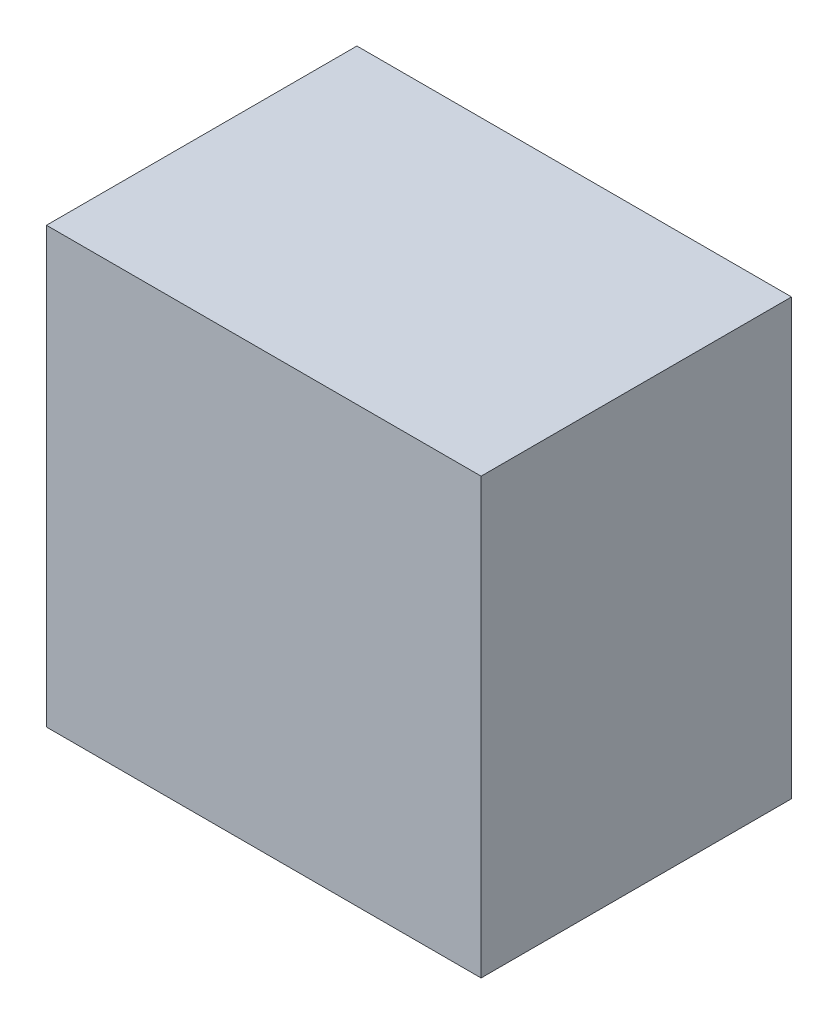
ISO-10303-21;
HEADER;
FILE_DESCRIPTION(('STEP AP214'),'2;1');
FILE_NAME('part.step','',(''),(''),'','','');
FILE_SCHEMA(('AUTOMOTIVE_DESIGN { 1 0 10303 214 1 1 1 1 }'));
ENDSEC;
DATA;
#1=APPLICATION_CONTEXT('core data for automotive mechanical design processes');
#2=APPLICATION_PROTOCOL_DEFINITION('international standard','automotive_design',2000,#1);
#3=PRODUCT_CONTEXT('',#1,'mechanical');
#4=PRODUCT('Part','Part','',(#3));
#5=PRODUCT_RELATED_PRODUCT_CATEGORY('part','',(#4));
#6=PRODUCT_DEFINITION_FORMATION('','',#4);
#7=PRODUCT_DEFINITION_CONTEXT('part definition',#1,'design');
#8=PRODUCT_DEFINITION('design','',#6,#7);
#9=PRODUCT_DEFINITION_SHAPE('','',#8);
#10=(LENGTH_UNIT() NAMED_UNIT(*) SI_UNIT(.MILLI.,.METRE.));
#11=(NAMED_UNIT(*) PLANE_ANGLE_UNIT() SI_UNIT($,.RADIAN.));
#12=(NAMED_UNIT(*) SI_UNIT($,.STERADIAN.) SOLID_ANGLE_UNIT());
#13=UNCERTAINTY_MEASURE_WITH_UNIT(LENGTH_MEASURE(1.E-05),#10,'distance_accuracy_value','');
#14=(GEOMETRIC_REPRESENTATION_CONTEXT(3) GLOBAL_UNCERTAINTY_ASSIGNED_CONTEXT((#13)) GLOBAL_UNIT_ASSIGNED_CONTEXT((#10,
#11,#12)) REPRESENTATION_CONTEXT('',''));
#15=CARTESIAN_POINT('',(0.,0.,0.));
#16=DIRECTION('',(0.,0.,1.));
#17=DIRECTION('',(1.,0.,0.));
#18=AXIS2_PLACEMENT_3D('',#15,#16,#17);
#19=CARTESIAN_POINT('',(-28.,142.,-780.));
#20=DIRECTION('',(-1.,0.,0.));
#21=DIRECTION('',(0.,0.,1.));
#22=AXIS2_PLACEMENT_3D('',#19,#20,#21);
#23=PLANE('',#22);
#24=DIRECTION('',(0.,-1.,0.));
#25=VECTOR('',#24,1.);
#26=CARTESIAN_POINT('',(-28.,142.,-740.));
#27=LINE('',#26,#25);
#28=CARTESIAN_POINT('',(-28.,198.,-740.));
#29=VERTEX_POINT('',#28);
#30=CARTESIAN_POINT('',(-28.,142.,-740.));
#31=VERTEX_POINT('',#30);
#32=EDGE_CURVE('E103',#29,#31,#27,.T.);
#33=ORIENTED_EDGE('',*,*,#32,.F.);
#34=DIRECTION('',(0.,0.,1.));
#35=VECTOR('',#34,1.);
#36=CARTESIAN_POINT('',(-28.,198.,-780.));
#37=LINE('',#36,#35);
#38=CARTESIAN_POINT('',(-28.,198.,-780.));
#39=VERTEX_POINT('',#38);
#40=EDGE_CURVE('E11',#39,#29,#37,.T.);
#41=ORIENTED_EDGE('',*,*,#40,.F.);
#42=DIRECTION('',(0.,-1.,0.));
#43=VECTOR('',#42,1.);
#44=CARTESIAN_POINT('',(-28.,142.,-780.));
#45=LINE('',#44,#43);
#46=CARTESIAN_POINT('',(-28.,142.,-780.));
#47=VERTEX_POINT('',#46);
#48=EDGE_CURVE('E97',#39,#47,#45,.T.);
#49=ORIENTED_EDGE('',*,*,#48,.T.);
#50=DIRECTION('',(0.,0.,1.));
#51=VECTOR('',#50,1.);
#52=CARTESIAN_POINT('',(-28.,142.,-780.));
#53=LINE('',#52,#51);
#54=EDGE_CURVE('E42',#47,#31,#53,.T.);
#55=ORIENTED_EDGE('',*,*,#54,.T.);
#56=EDGE_LOOP('',(#33,#41,#49,#55));
#57=FACE_BOUND('',#56,.T.);
#58=ADVANCED_FACE('F39',(#57),#23,.T.);
#59=CARTESIAN_POINT('',(-28.,198.,-780.));
#60=DIRECTION('',(0.,1.,0.));
#61=DIRECTION('',(0.,0.,1.));
#62=AXIS2_PLACEMENT_3D('',#59,#60,#61);
#63=PLANE('',#62);
#64=DIRECTION('',(-1.,0.,0.));
#65=VECTOR('',#64,1.);
#66=CARTESIAN_POINT('',(-28.,198.,-740.));
#67=LINE('',#66,#65);
#68=CARTESIAN_POINT('',(28.,198.,-740.));
#69=VERTEX_POINT('',#68);
#70=EDGE_CURVE('E99',#69,#29,#67,.T.);
#71=ORIENTED_EDGE('',*,*,#70,.F.);
#72=DIRECTION('',(0.,0.,1.));
#73=VECTOR('',#72,1.);
#74=CARTESIAN_POINT('',(28.,198.,-780.));
#75=LINE('',#74,#73);
#76=CARTESIAN_POINT('',(28.,198.,-780.));
#77=VERTEX_POINT('',#76);
#78=EDGE_CURVE('E48',#77,#69,#75,.T.);
#79=ORIENTED_EDGE('',*,*,#78,.F.);
#80=DIRECTION('',(-1.,0.,0.));
#81=VECTOR('',#80,1.);
#82=CARTESIAN_POINT('',(-28.,198.,-780.));
#83=LINE('',#82,#81);
#84=EDGE_CURVE('E94',#77,#39,#83,.T.);
#85=ORIENTED_EDGE('',*,*,#84,.T.);
#86=ORIENTED_EDGE('',*,*,#40,.T.);
#87=EDGE_LOOP('',(#71,#79,#85,#86));
#88=FACE_BOUND('',#87,.T.);
#89=ADVANCED_FACE('F113',(#88),#63,.T.);
#90=CARTESIAN_POINT('',(28.,142.,-780.));
#91=DIRECTION('',(1.,0.,0.));
#92=DIRECTION('',(0.,0.,-1.));
#93=AXIS2_PLACEMENT_3D('',#90,#91,#92);
#94=PLANE('',#93);
#95=DIRECTION('',(0.,1.,0.));
#96=VECTOR('',#95,1.);
#97=CARTESIAN_POINT('',(28.,142.,-740.));
#98=LINE('',#97,#96);
#99=CARTESIAN_POINT('',(28.,142.,-740.));
#100=VERTEX_POINT('',#99);
#101=EDGE_CURVE('E89',#100,#69,#98,.T.);
#102=ORIENTED_EDGE('',*,*,#101,.F.);
#103=DIRECTION('',(0.,0.,1.));
#104=VECTOR('',#103,1.);
#105=CARTESIAN_POINT('',(28.,142.,-780.));
#106=LINE('',#105,#104);
#107=CARTESIAN_POINT('',(28.,142.,-780.));
#108=VERTEX_POINT('',#107);
#109=EDGE_CURVE('E84',#108,#100,#106,.T.);
#110=ORIENTED_EDGE('',*,*,#109,.F.);
#111=DIRECTION('',(0.,1.,0.));
#112=VECTOR('',#111,1.);
#113=CARTESIAN_POINT('',(28.,142.,-780.));
#114=LINE('',#113,#112);
#115=EDGE_CURVE('E87',#108,#77,#114,.T.);
#116=ORIENTED_EDGE('',*,*,#115,.T.);
#117=ORIENTED_EDGE('',*,*,#78,.T.);
#118=EDGE_LOOP('',(#102,#110,#116,#117));
#119=FACE_BOUND('',#118,.T.);
#120=ADVANCED_FACE('F86',(#119),#94,.T.);
#121=CARTESIAN_POINT('',(-28.,142.,-780.));
#122=DIRECTION('',(0.,-1.,0.));
#123=DIRECTION('',(0.,0.,-1.));
#124=AXIS2_PLACEMENT_3D('',#121,#122,#123);
#125=PLANE('',#124);
#126=DIRECTION('',(1.,0.,0.));
#127=VECTOR('',#126,1.);
#128=CARTESIAN_POINT('',(-28.,142.,-740.));
#129=LINE('',#128,#127);
#130=EDGE_CURVE('E106',#31,#100,#129,.T.);
#131=ORIENTED_EDGE('',*,*,#130,.F.);
#132=ORIENTED_EDGE('',*,*,#54,.F.);
#133=DIRECTION('',(1.,0.,0.));
#134=VECTOR('',#133,1.);
#135=CARTESIAN_POINT('',(-28.,142.,-780.));
#136=LINE('',#135,#134);
#137=EDGE_CURVE('E93',#47,#108,#136,.T.);
#138=ORIENTED_EDGE('',*,*,#137,.T.);
#139=ORIENTED_EDGE('',*,*,#109,.T.);
#140=EDGE_LOOP('',(#131,#132,#138,#139));
#141=FACE_BOUND('',#140,.T.);
#142=ADVANCED_FACE('F96',(#141),#125,.T.);
#143=CARTESIAN_POINT('',(0.,0.,-780.));
#144=DIRECTION('',(0.,0.,-1.));
#145=DIRECTION('',(-1.,0.,0.));
#146=AXIS2_PLACEMENT_3D('',#143,#144,#145);
#147=PLANE('',#146);
#148=ORIENTED_EDGE('',*,*,#48,.F.);
#149=ORIENTED_EDGE('',*,*,#84,.F.);
#150=ORIENTED_EDGE('',*,*,#115,.F.);
#151=ORIENTED_EDGE('',*,*,#137,.F.);
#152=EDGE_LOOP('',(#148,#149,#150,#151));
#153=FACE_BOUND('',#152,.T.);
#154=ADVANCED_FACE('F92',(#153),#147,.T.);
#155=CARTESIAN_POINT('',(0.,0.,-740.));
#156=DIRECTION('',(0.,0.,-1.));
#157=DIRECTION('',(-1.,0.,0.));
#158=AXIS2_PLACEMENT_3D('',#155,#156,#157);
#159=PLANE('',#158);
#160=ORIENTED_EDGE('',*,*,#32,.T.);
#161=ORIENTED_EDGE('',*,*,#130,.T.);
#162=ORIENTED_EDGE('',*,*,#101,.T.);
#163=ORIENTED_EDGE('',*,*,#70,.T.);
#164=EDGE_LOOP('',(#160,#161,#162,#163));
#165=FACE_BOUND('',#164,.T.);
#166=ADVANCED_FACE('F112',(#165),#159,.F.);
#167=CLOSED_SHELL('',(#58,#89,#120,#142,#154,#166));
#168=MANIFOLD_SOLID_BREP('B2',#167);
#169=ADVANCED_BREP_SHAPE_REPRESENTATION('',(#18,#168),#14);
#170=SHAPE_DEFINITION_REPRESENTATION(#9,#169);
ENDSEC;
END-ISO-10303-21;
